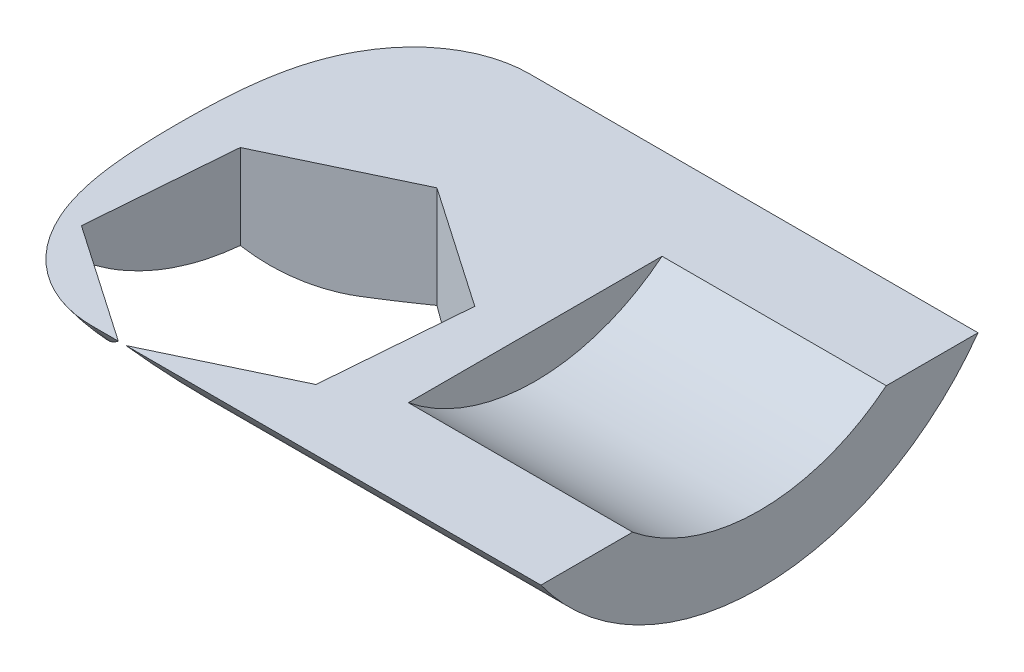
ISO-10303-21;
HEADER;
FILE_DESCRIPTION(('STEP AP214'),'2;1');
FILE_NAME('part.step','',(''),(''),'','','');
FILE_SCHEMA(('AUTOMOTIVE_DESIGN { 1 0 10303 214 1 1 1 1 }'));
ENDSEC;
DATA;
#1=APPLICATION_CONTEXT('core data for automotive mechanical design processes');
#2=APPLICATION_PROTOCOL_DEFINITION('international standard','automotive_design',2000,#1);
#3=PRODUCT_CONTEXT('',#1,'mechanical');
#4=PRODUCT('Part','Part','',(#3));
#5=PRODUCT_RELATED_PRODUCT_CATEGORY('part','',(#4));
#6=PRODUCT_DEFINITION_FORMATION('','',#4);
#7=PRODUCT_DEFINITION_CONTEXT('part definition',#1,'design');
#8=PRODUCT_DEFINITION('design','',#6,#7);
#9=PRODUCT_DEFINITION_SHAPE('','',#8);
#10=(LENGTH_UNIT() NAMED_UNIT(*) SI_UNIT(.MILLI.,.METRE.));
#11=(NAMED_UNIT(*) PLANE_ANGLE_UNIT() SI_UNIT($,.RADIAN.));
#12=(NAMED_UNIT(*) SI_UNIT($,.STERADIAN.) SOLID_ANGLE_UNIT());
#13=UNCERTAINTY_MEASURE_WITH_UNIT(LENGTH_MEASURE(1.E-05),#10,'distance_accuracy_value','');
#14=(GEOMETRIC_REPRESENTATION_CONTEXT(3) GLOBAL_UNCERTAINTY_ASSIGNED_CONTEXT((#13)) GLOBAL_UNIT_ASSIGNED_CONTEXT((#10,
#11,#12)) REPRESENTATION_CONTEXT('',''));
#15=CARTESIAN_POINT('',(0.,0.,0.));
#16=DIRECTION('',(0.,0.,1.));
#17=DIRECTION('',(1.,0.,0.));
#18=AXIS2_PLACEMENT_3D('',#15,#16,#17);
#19=CARTESIAN_POINT('',(31.3,-26.5,-15.));
#20=DIRECTION('',(1.,0.,0.));
#21=DIRECTION('',(0.,0.,-1.));
#22=AXIS2_PLACEMENT_3D('',#19,#20,#21);
#23=CYLINDRICAL_SURFACE('',#22,6.);
#24=DIRECTION('',(1.,0.,0.));
#25=VECTOR('',#24,1.);
#26=CARTESIAN_POINT('',(31.3,-30.,-10.1266028275955));
#27=LINE('',#26,#25);
#28=CARTESIAN_POINT('',(34.8761108116179,-30.,-10.1266028275955));
#29=VERTEX_POINT('',#28);
#30=CARTESIAN_POINT('',(34.3,-30.,-10.1266028275955));
#31=VERTEX_POINT('',#30);
#32=EDGE_CURVE('E173',#29,#31,#27,.F.);
#33=ORIENTED_EDGE('',*,*,#32,.T.);
#34=CARTESIAN_POINT('',(34.3,-26.5,-15.));
#35=DIRECTION('',(-1.,0.,0.));
#36=DIRECTION('',(0.,0.,1.));
#37=AXIS2_PLACEMENT_3D('',#34,#35,#36);
#38=CIRCLE('',#37,6.);
#39=CARTESIAN_POINT('',(34.3,-30.4949345628794,-10.5233385387868));
#40=VERTEX_POINT('',#39);
#41=EDGE_CURVE('E199',#31,#40,#38,.F.);
#42=ORIENTED_EDGE('',*,*,#41,.T.);
#43=CARTESIAN_POINT('',(27.7993170642149,-26.5,-15.));
#44=DIRECTION('',(0.567168892324626,0.,-0.823601510185148));
#45=DIRECTION('',(0.823601510185148,0.,0.567168892324626));
#46=AXIS2_PLACEMENT_3D('',#43,#44,#45);
#47=ELLIPSE('',#46,10.5788594564982,6.);
#48=EDGE_CURVE('E184',#29,#40,#47,.T.);
#49=ORIENTED_EDGE('',*,*,#48,.F.);
#50=EDGE_LOOP('',(#33,#42,#49));
#51=FACE_BOUND('',#50,.T.);
#52=ADVANCED_FACE('F42',(#51),#23,.T.);
#53=CARTESIAN_POINT('',(34.3,-26.5,-15.));
#54=DIRECTION('',(-1.,0.,0.));
#55=DIRECTION('',(0.,0.,1.));
#56=AXIS2_PLACEMENT_3D('',#53,#54,#55);
#57=CIRCLE('',#56,6.);
#58=CARTESIAN_POINT('',(34.3,-32.401387876061,-16.0833379603247));
#59=VERTEX_POINT('',#58);
#60=CARTESIAN_POINT('',(34.3,-30.,-19.8733971724045));
#61=VERTEX_POINT('',#60);
#62=EDGE_CURVE('E195',#59,#61,#57,.F.);
#63=ORIENTED_EDGE('',*,*,#62,.T.);
#64=DIRECTION('',(1.,0.,0.));
#65=VECTOR('',#64,1.);
#66=CARTESIAN_POINT('',(31.3,-30.,-19.8733971724045));
#67=LINE('',#66,#65);
#68=CARTESIAN_POINT('',(44.3,-30.,-19.8733971724045));
#69=VERTEX_POINT('',#68);
#70=EDGE_CURVE('E292',#61,#69,#67,.T.);
#71=ORIENTED_EDGE('',*,*,#70,.T.);
#72=CARTESIAN_POINT('',(44.3,-26.5,-15.));
#73=DIRECTION('',(-1.,0.,0.));
#74=DIRECTION('',(0.,0.,1.));
#75=AXIS2_PLACEMENT_3D('',#72,#73,#74);
#76=CIRCLE('',#75,6.);
#77=CARTESIAN_POINT('',(44.3,-30.,-10.1266028275955));
#78=VERTEX_POINT('',#77);
#79=EDGE_CURVE('E169',#69,#78,#76,.T.);
#80=ORIENTED_EDGE('',*,*,#79,.T.);
#81=CARTESIAN_POINT('',(35.0474640746686,-30.,-10.1266028275955));
#82=VERTEX_POINT('',#81);
#83=EDGE_CURVE('E174',#78,#82,#27,.F.);
#84=ORIENTED_EDGE('',*,*,#83,.T.);
#85=CARTESIAN_POINT('',(45.2891419247907,-26.5,-15.));
#86=DIRECTION('',(-0.429675384253254,0.,-0.902983424081981));
#87=DIRECTION('',(0.902983424081981,0.,-0.429675384253254));
#88=AXIS2_PLACEMENT_3D('',#85,#86,#87);
#89=ELLIPSE('',#88,13.9640301024635,6.);
#90=CARTESIAN_POINT('',(37.9177553890348,-31.367931025036,-11.4924014574795));
#91=VERTEX_POINT('',#90);
#92=EDGE_CURVE('E191',#91,#82,#89,.T.);
#93=ORIENTED_EDGE('',*,*,#92,.F.);
#94=CARTESIAN_POINT('',(38.197076735437,-26.5,-15.));
#95=DIRECTION('',(-0.996844276577879,0.,-0.0793819138968336));
#96=DIRECTION('',(0.0793819138968336,0.,-0.996844276577879));
#97=AXIS2_PLACEMENT_3D('',#94,#95,#96);
#98=ELLIPSE('',#97,6.01899428123089,6.);
#99=CARTESIAN_POINT('',(38.1789930543704,-32.4957010781389,-14.772912832587));
#100=VERTEX_POINT('',#99);
#101=EDGE_CURVE('E188',#100,#91,#98,.T.);
#102=ORIENTED_EDGE('',*,*,#101,.F.);
#103=CARTESIAN_POINT('',(37.8492335478883,-26.5,-15.));
#104=DIRECTION('',(-0.567168892324626,0.,0.823601510185148));
#105=DIRECTION('',(0.823601510185148,0.,0.567168892324626));
#106=AXIS2_PLACEMENT_3D('',#103,#104,#105);
#107=ELLIPSE('',#106,10.5788594564982,6.);
#108=CARTESIAN_POINT('',(35.4686056987913,-32.2716847428764,-16.6394069747467));
#109=VERTEX_POINT('',#108);
#110=EDGE_CURVE('E178',#109,#100,#107,.T.);
#111=ORIENTED_EDGE('',*,*,#110,.F.);
#112=CARTESIAN_POINT('',(32.0233133274504,-26.5,-15.));
#113=DIRECTION('',(0.429675384253253,0.,0.902983424081981));
#114=DIRECTION('',(0.902983424081981,0.,-0.429675384253253));
#115=AXIS2_PLACEMENT_3D('',#112,#113,#114);
#116=ELLIPSE('',#115,13.9640301024635,6.);
#117=EDGE_CURVE('E181',#59,#109,#116,.T.);
#118=ORIENTED_EDGE('',*,*,#117,.F.);
#119=EDGE_LOOP('',(#63,#71,#80,#84,#93,#102,#111,#118));
#120=FACE_BOUND('',#119,.T.);
#121=ADVANCED_FACE('F235',(#120),#23,.T.);
#122=CARTESIAN_POINT('',(44.3,-26.5,-15.));
#123=DIRECTION('',(-1.,0.,0.));
#124=DIRECTION('',(0.,0.,1.));
#125=AXIS2_PLACEMENT_3D('',#122,#123,#124);
#126=PLANE('',#125);
#127=ORIENTED_EDGE('',*,*,#79,.F.);
#128=DIRECTION('',(0.,0.,1.));
#129=VECTOR('',#128,1.);
#130=CARTESIAN_POINT('',(44.3,-30.,-15.));
#131=LINE('',#130,#129);
#132=CARTESIAN_POINT('',(44.3,-30.,-17.8284271247462));
#133=VERTEX_POINT('',#132);
#134=EDGE_CURVE('E308',#69,#133,#131,.T.);
#135=ORIENTED_EDGE('',*,*,#134,.T.);
#136=CARTESIAN_POINT('',(44.3,-26.5,-15.));
#137=DIRECTION('',(1.,0.,0.));
#138=DIRECTION('',(0.,0.,-1.));
#139=AXIS2_PLACEMENT_3D('',#136,#137,#138);
#140=CIRCLE('',#139,4.5);
#141=CARTESIAN_POINT('',(44.3,-30.,-12.1715728752538));
#142=VERTEX_POINT('',#141);
#143=EDGE_CURVE('E137',#142,#133,#140,.T.);
#144=ORIENTED_EDGE('',*,*,#143,.F.);
#145=EDGE_CURVE('E139',#142,#78,#131,.T.);
#146=ORIENTED_EDGE('',*,*,#145,.T.);
#147=EDGE_LOOP('',(#127,#135,#144,#146));
#148=FACE_BOUND('',#147,.T.);
#149=ADVANCED_FACE('F231',(#148),#126,.F.);
#150=CARTESIAN_POINT('',(38.1789930543704,-43.,-14.772912832587));
#151=DIRECTION('',(-0.996844276577879,0.,-0.0793819138968336));
#152=DIRECTION('',(-0.0793819138968336,0.,0.996844276577879));
#153=AXIS2_PLACEMENT_3D('',#150,#151,#152);
#154=PLANE('',#153);
#155=DIRECTION('',(-0.0793819138968336,0.,0.99684427657788));
#156=VECTOR('',#155,1.);
#157=CARTESIAN_POINT('',(38.1789930543704,-30.,-14.772912832587));
#158=LINE('',#157,#156);
#159=CARTESIAN_POINT('',(38.1789930543704,-30.,-14.772912832587));
#160=VERTEX_POINT('',#159);
#161=CARTESIAN_POINT('',(37.9177553890348,-30.,-11.4924014574795));
#162=VERTEX_POINT('',#161);
#163=EDGE_CURVE('E297',#160,#162,#158,.T.);
#164=ORIENTED_EDGE('',*,*,#163,.F.);
#165=DIRECTION('',(0.,1.,0.));
#166=VECTOR('',#165,1.);
#167=CARTESIAN_POINT('',(38.1789930543704,-43.,-14.772912832587));
#168=LINE('',#167,#166);
#169=EDGE_CURVE('E143',#100,#160,#168,.T.);
#170=ORIENTED_EDGE('',*,*,#169,.F.);
#171=ORIENTED_EDGE('',*,*,#101,.T.);
#172=DIRECTION('',(0.,1.,0.));
#173=VECTOR('',#172,1.);
#174=CARTESIAN_POINT('',(37.9177553890348,-43.,-11.4924014574795));
#175=LINE('',#174,#173);
#176=EDGE_CURVE('E165',#91,#162,#175,.T.);
#177=ORIENTED_EDGE('',*,*,#176,.T.);
#178=EDGE_LOOP('',(#164,#170,#171,#177));
#179=FACE_BOUND('',#178,.T.);
#180=ADVANCED_FACE('F227',(#179),#154,.T.);
#181=CARTESIAN_POINT('',(37.9177553890348,-43.,-11.4924014574795));
#182=DIRECTION('',(-0.429675384253254,0.,-0.902983424081981));
#183=DIRECTION('',(-0.902983424081981,0.,0.429675384253254));
#184=AXIS2_PLACEMENT_3D('',#181,#182,#183);
#185=PLANE('',#184);
#186=DIRECTION('',(-0.902983424081981,0.,0.429675384253254));
#187=VECTOR('',#186,1.);
#188=CARTESIAN_POINT('',(37.9177553890348,-30.,-11.4924014574795));
#189=LINE('',#188,#187);
#190=EDGE_CURVE('E150',#162,#82,#189,.T.);
#191=ORIENTED_EDGE('',*,*,#190,.F.);
#192=ORIENTED_EDGE('',*,*,#176,.F.);
#193=ORIENTED_EDGE('',*,*,#92,.T.);
#194=EDGE_LOOP('',(#191,#192,#193));
#195=FACE_BOUND('',#194,.T.);
#196=ADVANCED_FACE('F221',(#195),#185,.T.);
#197=CARTESIAN_POINT('',(34.9461303681201,-43.,-10.0783842245317));
#198=DIRECTION('',(0.567168892324626,0.,-0.823601510185148));
#199=DIRECTION('',(-0.823601510185148,0.,-0.567168892324626));
#200=AXIS2_PLACEMENT_3D('',#197,#198,#199);
#201=PLANE('',#200);
#202=DIRECTION('',(-0.823601510185148,0.,-0.567168892324626));
#203=VECTOR('',#202,1.);
#204=CARTESIAN_POINT('',(34.9461303681201,-30.,-10.0783842245317));
#205=LINE('',#204,#203);
#206=CARTESIAN_POINT('',(32.2357430125409,-30.,-11.9448783666914));
#207=VERTEX_POINT('',#206);
#208=EDGE_CURVE('E286',#29,#207,#205,.T.);
#209=ORIENTED_EDGE('',*,*,#208,.F.);
#210=ORIENTED_EDGE('',*,*,#48,.T.);
#211=CARTESIAN_POINT('',(34.3,-30.4949345628794,-10.5233385387868));
#212=CARTESIAN_POINT('',(34.2469889890921,-30.5358375123047,-10.5598442954735));
#213=CARTESIAN_POINT('',(34.1927859932294,-30.5744281804482,-10.597170906394));
#214=CARTESIAN_POINT('',(34.0821135552941,-30.6466025272526,-10.673384904618));
#215=CARTESIAN_POINT('',(34.0256424061577,-30.6801823414887,-10.7122734674824));
#216=CARTESIAN_POINT('',(33.8522232628604,-30.773227213168,-10.8316976576951));
#217=CARTESIAN_POINT('',(33.7321093170296,-30.8243397624952,-10.914413501179));
#218=CARTESIAN_POINT('',(33.4857331791529,-30.9008607501251,-11.0840791458952));
#219=CARTESIAN_POINT('',(33.3594417518117,-30.926131393864,-11.1710490798612));
#220=CARTESIAN_POINT('',(33.1056753440101,-30.9470238927237,-11.3458039954875));
#221=CARTESIAN_POINT('',(32.9782115735421,-30.9428179332784,-11.4335812574447));
#222=CARTESIAN_POINT('',(32.7989571158868,-30.9143334080989,-11.5570239065114));
#223=CARTESIAN_POINT('',(32.7456382129516,-30.9029311616177,-11.5937416914399));
#224=CARTESIAN_POINT('',(32.6400649320713,-30.8743045752227,-11.6664441817042));
#225=CARTESIAN_POINT('',(32.5878102580452,-30.8570818787513,-11.7024290909348));
#226=CARTESIAN_POINT('',(32.484333134612,-30.8165804940874,-11.7736880732858));
#227=CARTESIAN_POINT('',(32.4331264321711,-30.7932424218798,-11.8089513023399));
#228=CARTESIAN_POINT('',(32.3327591581326,-30.7406661018427,-11.8780687030952));
#229=CARTESIAN_POINT('',(32.2836004360919,-30.7114226544071,-11.9119216011085));
#230=CARTESIAN_POINT('',(32.2357430125409,-30.6792828658652,-11.9448783666914));
#231=B_SPLINE_CURVE_WITH_KNOTS('',3,(#211,#212,#213,#214,#215,#216,#217,#218,#219,#220,#221,
#222,#223,#224,#225,#226,#227,#228,#229,#230),.UNSPECIFIED.,.F.,.F.,(4,2,2,2,2,2,2,2,2,4),(0.,
0.228688758434566,0.457552982605989,0.918883531873738,1.38266136576086,1.84373234267548,
2.04072491224721,2.23766190607086,2.4365871143241,2.63568824337295),.UNSPECIFIED.);
#232=CARTESIAN_POINT('',(32.2357430125409,-30.6792828658652,-11.9448783666914));
#233=VERTEX_POINT('',#232);
#234=EDGE_CURVE('E202',#40,#233,#231,.T.);
#235=ORIENTED_EDGE('',*,*,#234,.T.);
#236=DIRECTION('',(0.,1.,0.));
#237=VECTOR('',#236,1.);
#238=CARTESIAN_POINT('',(32.2357430125409,-43.,-11.9448783666914));
#239=LINE('',#238,#237);
#240=EDGE_CURVE('E161',#233,#207,#239,.T.);
#241=ORIENTED_EDGE('',*,*,#240,.T.);
#242=EDGE_LOOP('',(#209,#210,#235,#241));
#243=FACE_BOUND('',#242,.T.);
#244=ADVANCED_FACE('F216',(#243),#201,.T.);
#245=CARTESIAN_POINT('',(32.2357430125409,-43.,-11.9448783666914));
#246=DIRECTION('',(0.996844276577879,0.,0.0793819138968337));
#247=DIRECTION('',(0.0793819138968337,0.,-0.996844276577879));
#248=AXIS2_PLACEMENT_3D('',#245,#246,#247);
#249=PLANE('',#248);
#250=DIRECTION('',(0.0793819138968337,0.,-0.99684427657788));
#251=VECTOR('',#250,1.);
#252=CARTESIAN_POINT('',(32.2357430125409,-30.,-11.9448783666914));
#253=LINE('',#252,#251);
#254=CARTESIAN_POINT('',(32.4969806778765,-30.,-15.2253897417989));
#255=VERTEX_POINT('',#254);
#256=EDGE_CURVE('E282',#207,#255,#253,.T.);
#257=ORIENTED_EDGE('',*,*,#256,.F.);
#258=ORIENTED_EDGE('',*,*,#240,.F.);
#259=CARTESIAN_POINT('',(32.2357430125409,-30.6792828658652,-11.9448783666914));
#260=CARTESIAN_POINT('',(32.2435051363516,-30.7596501108885,-12.0423518126562));
#261=CARTESIAN_POINT('',(32.2514897149194,-30.8365199877144,-12.1426187507465));
#262=CARTESIAN_POINT('',(32.2678704268688,-30.9829346871232,-12.3483207570527));
#263=CARTESIAN_POINT('',(32.2762665270224,-31.0524800996916,-12.4537554080052));
#264=CARTESIAN_POINT('',(32.3020603491228,-31.2499309651848,-12.7776632438044));
#265=CARTESIAN_POINT('',(32.3200304787784,-31.3663082114904,-13.003324480945));
#266=CARTESIAN_POINT('',(32.349539925575,-31.5250326298703,-13.3738915496898));
#267=CARTESIAN_POINT('',(32.3607230786645,-31.5782404120698,-13.5143248247791));
#268=CARTESIAN_POINT('',(32.3834058415424,-31.6725510769015,-13.7991653034455));
#269=CARTESIAN_POINT('',(32.3949053445532,-31.7136579904302,-13.9435711661553));
#270=CARTESIAN_POINT('',(32.4181135811646,-31.7833889734769,-14.2350103202378));
#271=CARTESIAN_POINT('',(32.4298218279595,-31.8120389182609,-14.3820374985111));
#272=CARTESIAN_POINT('',(32.4533833348975,-31.8567681810875,-14.6779128709446));
#273=CARTESIAN_POINT('',(32.4652364949548,-31.8728557267696,-14.8267598082696));
#274=CARTESIAN_POINT('',(32.4804262627323,-31.8853299957,-15.0175064447285));
#275=CARTESIAN_POINT('',(32.4837366489391,-31.8875560452172,-15.0590768652635));
#276=CARTESIAN_POINT('',(32.490357906162,-31.8910256187301,-15.1422237943606));
#277=CARTESIAN_POINT('',(32.493668774484,-31.8922699585009,-15.1838002690926));
#278=CARTESIAN_POINT('',(32.4969806778765,-31.8930247558007,-15.2253897417989));
#279=B_SPLINE_CURVE_WITH_KNOTS('',3,(#259,#260,#261,#262,#263,#264,#265,#266,#267,#268,#269,
#270,#271,#272,#273,#274,#275,#276,#277,#278),.UNSPECIFIED.,.F.,.F.,(4,2,2,2,2,2,2,2,2,4),(0.,
0.379521656063172,0.759012718243936,1.51960055095346,1.97092903825332,2.42210701385088,
2.87234328520011,3.32228443012563,3.44756127236426,3.57273390285082),.UNSPECIFIED.);
#280=CARTESIAN_POINT('',(32.4969806778765,-31.8930247558002,-15.2253897417989));
#281=VERTEX_POINT('',#280);
#282=EDGE_CURVE('E66',#233,#281,#279,.T.);
#283=ORIENTED_EDGE('',*,*,#282,.T.);
#284=DIRECTION('',(0.,1.,0.));
#285=VECTOR('',#284,1.);
#286=CARTESIAN_POINT('',(32.4969806778765,-43.,-15.2253897417989));
#287=LINE('',#286,#285);
#288=EDGE_CURVE('E158',#281,#255,#287,.T.);
#289=ORIENTED_EDGE('',*,*,#288,.T.);
#290=EDGE_LOOP('',(#257,#258,#283,#289));
#291=FACE_BOUND('',#290,.T.);
#292=ADVANCED_FACE('F220',(#291),#249,.T.);
#293=CARTESIAN_POINT('',(32.4969806778765,-43.,-15.2253897417989));
#294=DIRECTION('',(0.429675384253253,0.,0.902983424081981));
#295=DIRECTION('',(0.902983424081981,0.,-0.429675384253253));
#296=AXIS2_PLACEMENT_3D('',#293,#294,#295);
#297=PLANE('',#296);
#298=DIRECTION('',(0.902983424081981,0.,-0.429675384253253));
#299=VECTOR('',#298,1.);
#300=CARTESIAN_POINT('',(32.4969806778765,-30.,-15.2253897417989));
#301=LINE('',#300,#299);
#302=CARTESIAN_POINT('',(35.4686056987913,-30.,-16.6394069747467));
#303=VERTEX_POINT('',#302);
#304=EDGE_CURVE('E285',#255,#303,#301,.T.);
#305=ORIENTED_EDGE('',*,*,#304,.F.);
#306=ORIENTED_EDGE('',*,*,#288,.F.);
#307=CARTESIAN_POINT('',(32.4969806778765,-31.8930247558002,-15.2253897417989));
#308=CARTESIAN_POINT('',(32.5643435865098,-31.9423947238856,-15.2574436897226));
#309=CARTESIAN_POINT('',(32.633660051906,-31.9884769594771,-15.2904272175592));
#310=CARTESIAN_POINT('',(32.7756230531714,-32.073808515856,-15.3579788530507));
#311=CARTESIAN_POINT('',(32.848268862142,-32.1130593192627,-15.3925466148184));
#312=CARTESIAN_POINT('',(32.994352853087,-32.1835320306512,-15.462059180906));
#313=CARTESIAN_POINT('',(33.0677172280333,-32.2149414191538,-15.49696886491));
#314=CARTESIAN_POINT('',(33.2165189043427,-32.2709045145242,-15.5677746136543));
#315=CARTESIAN_POINT('',(33.2919561615554,-32.295458367284,-15.603670657386));
#316=CARTESIAN_POINT('',(33.5179693888634,-32.3579025561758,-15.7112167293292));
#317=CARTESIAN_POINT('',(33.6709244602291,-32.385855133188,-15.7839988284351));
#318=CARTESIAN_POINT('',(33.9037790691711,-32.4075308223644,-15.8948003015342));
#319=CARTESIAN_POINT('',(33.9830584484591,-32.4112869594923,-15.9325245795779));
#320=CARTESIAN_POINT('',(34.1416278215457,-32.4116672891318,-16.0079781864711));
#321=CARTESIAN_POINT('',(34.2209178145472,-32.4082918640463,-16.0457075149413));
#322=CARTESIAN_POINT('',(34.3,-32.401387876061,-16.0833379603247));
#323=B_SPLINE_CURVE_WITH_KNOTS('',3,(#307,#308,#309,#310,#311,#312,#313,#314,#315,#316,#317,
#318,#319,#320,#321,#322),.UNSPECIFIED.,.F.,.F.,(4,2,2,2,2,2,2,4),(0.,0.268270185096545,
0.536482074973463,0.797483347654204,1.05847906556785,1.57089289780647,1.83428870863059,
2.09767039621236),.UNSPECIFIED.);
#324=EDGE_CURVE('E244',#281,#59,#323,.T.);
#325=ORIENTED_EDGE('',*,*,#324,.T.);
#326=ORIENTED_EDGE('',*,*,#117,.T.);
#327=DIRECTION('',(0.,1.,0.));
#328=VECTOR('',#327,1.);
#329=CARTESIAN_POINT('',(35.4686056987913,-43.,-16.6394069747467));
#330=LINE('',#329,#328);
#331=EDGE_CURVE('E148',#109,#303,#330,.T.);
#332=ORIENTED_EDGE('',*,*,#331,.T.);
#333=EDGE_LOOP('',(#305,#306,#325,#326,#332));
#334=FACE_BOUND('',#333,.T.);
#335=ADVANCED_FACE('F250',(#334),#297,.T.);
#336=CARTESIAN_POINT('',(35.4686056987913,-43.,-16.6394069747467));
#337=DIRECTION('',(-0.567168892324626,0.,0.823601510185148));
#338=DIRECTION('',(0.823601510185148,0.,0.567168892324626));
#339=AXIS2_PLACEMENT_3D('',#336,#337,#338);
#340=PLANE('',#339);
#341=DIRECTION('',(0.823601510185148,0.,0.567168892324626));
#342=VECTOR('',#341,1.);
#343=CARTESIAN_POINT('',(35.4686056987913,-30.,-16.6394069747467));
#344=LINE('',#343,#342);
#345=EDGE_CURVE('E290',#303,#160,#344,.T.);
#346=ORIENTED_EDGE('',*,*,#345,.F.);
#347=ORIENTED_EDGE('',*,*,#331,.F.);
#348=ORIENTED_EDGE('',*,*,#110,.T.);
#349=ORIENTED_EDGE('',*,*,#169,.T.);
#350=EDGE_LOOP('',(#346,#347,#348,#349));
#351=FACE_BOUND('',#350,.T.);
#352=ADVANCED_FACE('F254',(#351),#340,.T.);
#353=CARTESIAN_POINT('',(34.3,-26.5,-15.));
#354=DIRECTION('',(-1.,0.,0.));
#355=DIRECTION('',(0.,0.,1.));
#356=AXIS2_PLACEMENT_3D('',#353,#354,#355);
#357=TOROIDAL_SURFACE('',#356,3.,3.);
#358=CARTESIAN_POINT('',(31.6635442484442,-30.,-17.7180710038325));
#359=CARTESIAN_POINT('',(31.6123433716961,-30.,-17.56432522151));
#360=CARTESIAN_POINT('',(31.5695004594068,-30.,-17.4078292765641));
#361=CARTESIAN_POINT('',(31.4977523790664,-30.,-17.0916173812309));
#362=CARTESIAN_POINT('',(31.4688617091126,-30.,-16.9318982602812));
#363=CARTESIAN_POINT('',(31.4218723530794,-30.,-16.6100110460859));
#364=CARTESIAN_POINT('',(31.4038367836246,-30.,-16.4478341460611));
#365=CARTESIAN_POINT('',(31.3757837411868,-30.,-16.1228772543403));
#366=CARTESIAN_POINT('',(31.3657641704447,-30.,-15.9600974316369));
#367=CARTESIAN_POINT('',(31.3542697764837,-30.,-15.7017357963087));
#368=CARTESIAN_POINT('',(31.35097477504,-30.,-15.6062249211424));
#369=CARTESIAN_POINT('',(31.3459533067539,-30.,-15.4151601571404));
#370=CARTESIAN_POINT('',(31.34422685994,-30.,-15.319606267771));
#371=CARTESIAN_POINT('',(31.3421327107413,-30.,-15.1284639231322));
#372=CARTESIAN_POINT('',(31.3417653034738,-30.,-15.0328754648625));
#373=CARTESIAN_POINT('',(31.3423449317167,-30.,-14.8417034003456));
#374=CARTESIAN_POINT('',(31.343291956541,-30.,-14.7461197940652));
#375=CARTESIAN_POINT('',(31.3466136284885,-30.,-14.5551475931861));
#376=CARTESIAN_POINT('',(31.3489856944572,-30.,-14.459758958132));
#377=CARTESIAN_POINT('',(31.3554299877492,-30.,-14.269039805221));
#378=CARTESIAN_POINT('',(31.3595022676127,-30.,-14.1737092892513));
#379=CARTESIAN_POINT('',(31.3748423838544,-30.,-13.8879359531525));
#380=CARTESIAN_POINT('',(31.389234355574,-30.,-13.6976246294738));
#381=CARTESIAN_POINT('',(31.4241417207995,-30.,-13.378091155224));
#382=CARTESIAN_POINT('',(31.4412996691355,-30.,-13.2485115846191));
#383=CARTESIAN_POINT('',(31.4831701134921,-30.,-12.9905312858166));
#384=CARTESIAN_POINT('',(31.5078834044257,-30.,-12.8621306831255));
#385=CARTESIAN_POINT('',(31.5663782235917,-30.,-12.6077321605245));
#386=CARTESIAN_POINT('',(31.6001345026777,-30.,-12.4817285813252));
#387=CARTESIAN_POINT('',(31.6781509739457,-30.,-12.2330720388804));
#388=CARTESIAN_POINT('',(31.7224065097745,-30.,-12.1104176171178));
#389=CARTESIAN_POINT('',(31.8426852913658,-30.,-11.8220111919688));
#390=CARTESIAN_POINT('',(31.9243441968816,-30.,-11.6584977475071));
#391=CARTESIAN_POINT('',(32.065526041276,-30.,-11.4245153497321));
#392=CARTESIAN_POINT('',(32.1157513642025,-30.,-11.3483443962193));
#393=CARTESIAN_POINT('',(32.2224945529945,-30.,-11.2005656369987));
#394=CARTESIAN_POINT('',(32.2790092871793,-30.,-11.128955587966));
#395=CARTESIAN_POINT('',(32.3988809739812,-30.,-10.9904184186303));
#396=CARTESIAN_POINT('',(32.4623015894131,-30.,-10.9235462469297));
#397=CARTESIAN_POINT('',(32.5952362921128,-30.,-10.7962125540847));
#398=CARTESIAN_POINT('',(32.6647471392877,-30.,-10.735747661553));
#399=CARTESIAN_POINT('',(32.8094778055488,-30.,-10.6220732976967));
#400=CARTESIAN_POINT('',(32.8846974740728,-30.,-10.568863635129));
#401=CARTESIAN_POINT('',(33.0402521515793,-30.,-10.4705473312334));
#402=CARTESIAN_POINT('',(33.120585892088,-30.,-10.4254386910855));
#403=CARTESIAN_POINT('',(33.2733031328372,-30.,-10.3501441606103));
#404=CARTESIAN_POINT('',(33.3450863274419,-30.,-10.3187361080721));
#405=CARTESIAN_POINT('',(33.4912575241437,-30.,-10.2627302340619));
#406=CARTESIAN_POINT('',(33.5656450755332,-30.,-10.2381312407189));
#407=CARTESIAN_POINT('',(33.7162044627522,-30.,-10.1961240451555));
#408=CARTESIAN_POINT('',(33.7923709234221,-30.,-10.1786965577184));
#409=CARTESIAN_POINT('',(33.9459791941969,-30.,-10.1511818770967));
#410=CARTESIAN_POINT('',(34.0234200576132,-30.,-10.1410894663107));
#411=CARTESIAN_POINT('',(34.134214416878,-30.,-10.1320216662137));
#412=CARTESIAN_POINT('',(34.1673396147606,-30.,-10.129990520006));
#413=CARTESIAN_POINT('',(34.2336393567248,-30.,-10.1272803777115));
#414=CARTESIAN_POINT('',(34.2668138967544,-30.,-10.12660127613));
#415=CARTESIAN_POINT('',(34.4309118800652,-30.,-10.1266089477849));
#416=CARTESIAN_POINT('',(34.5620036986903,-30.,-10.1372069075137));
#417=CARTESIAN_POINT('',(34.8209748403246,-30.,-10.1792370707013));
#418=CARTESIAN_POINT('',(34.9488466627342,-30.,-10.2107139514153));
#419=CARTESIAN_POINT('',(35.2043731482392,-30.,-10.2954317749365));
#420=CARTESIAN_POINT('',(35.3316911849956,-30.,-10.3496908984945));
#421=CARTESIAN_POINT('',(35.5759854630817,-30.,-10.4777279356255));
#422=CARTESIAN_POINT('',(35.6929639906805,-30.,-10.5515015196891));
#423=CARTESIAN_POINT('',(35.9204682059896,-30.,-10.7203926912185));
#424=CARTESIAN_POINT('',(36.0302850104038,-30.,-10.8164611139233));
#425=CARTESIAN_POINT('',(36.2344025342536,-30.,-11.0239052867716));
#426=CARTESIAN_POINT('',(36.3286926904574,-30.,-11.1352913641898));
#427=CARTESIAN_POINT('',(36.4750342335455,-30.,-11.3343115022869));
#428=CARTESIAN_POINT('',(36.5312385160663,-30.,-11.4189492549023));
#429=CARTESIAN_POINT('',(36.6359392677437,-30.,-11.5928865735341));
#430=CARTESIAN_POINT('',(36.6844329602057,-30.,-11.6821878036264));
#431=CARTESIAN_POINT('',(36.8186577655214,-30.,-11.9554810343054));
#432=CARTESIAN_POINT('',(36.8932351745005,-30.,-12.1450065574364));
#433=CARTESIAN_POINT('',(37.0179556823985,-30.,-12.5364706742348));
#434=CARTESIAN_POINT('',(37.0674775363099,-30.,-12.7385970352497));
#435=CARTESIAN_POINT('',(37.1456551515978,-30.,-13.1470320899099));
#436=CARTESIAN_POINT('',(37.1742722772656,-30.,-13.353347806886));
#437=CARTESIAN_POINT('',(37.2063790079689,-30.,-13.6648957745002));
#438=CARTESIAN_POINT('',(37.2152958523229,-30.,-13.7696450083073));
#439=CARTESIAN_POINT('',(37.230157065618,-30.,-13.9793561349332));
#440=CARTESIAN_POINT('',(37.2361015118183,-30.,-14.0843180221535));
#441=CARTESIAN_POINT('',(37.2456489529433,-30.,-14.2942649569644));
#442=CARTESIAN_POINT('',(37.249253639325,-30.,-14.3992499328163));
#443=CARTESIAN_POINT('',(37.2545909867161,-30.,-14.6092659431973));
#444=CARTESIAN_POINT('',(37.2563236481708,-30.,-14.7142969777154));
#445=CARTESIAN_POINT('',(37.2582736042759,-30.,-14.9357645046881));
#446=CARTESIAN_POINT('',(37.2583061752853,-30.,-15.0522025852358));
#447=CARTESIAN_POINT('',(37.2563953125421,-30.,-15.285063699483));
#448=CARTESIAN_POINT('',(37.2544518584642,-30.,-15.4014867330153));
#449=CARTESIAN_POINT('',(37.2482363169167,-30.,-15.6343894756571));
#450=CARTESIAN_POINT('',(37.2439619909202,-30.,-15.7508691315326));
#451=CARTESIAN_POINT('',(37.2324126548417,-30.,-15.9836744646101));
#452=CARTESIAN_POINT('',(37.2251376384644,-30.,-16.1000001414887));
#453=CARTESIAN_POINT('',(37.1976713286795,-30.,-16.4461351126753));
#454=CARTESIAN_POINT('',(37.1718074061937,-30.,-16.6755766365197));
#455=CARTESIAN_POINT('',(37.0963565894967,-30.,-17.1302798668485));
#456=CARTESIAN_POINT('',(37.0468265748736,-30.,-17.355550256892));
#457=CARTESIAN_POINT('',(36.9226991175841,-30.,-17.7725744723753));
#458=CARTESIAN_POINT('',(36.8514772339159,-30.,-17.9652808934241));
#459=CARTESIAN_POINT('',(36.7222223248754,-30.,-18.2439143668709));
#460=CARTESIAN_POINT('',(36.6753842190171,-30.,-18.3350783631366));
#461=CARTESIAN_POINT('',(36.5739221282545,-30.,-18.512940709385));
#462=CARTESIAN_POINT('',(36.5193004912821,-30.,-18.599640395346));
#463=CARTESIAN_POINT('',(36.3680057394286,-30.,-18.8162814109322));
#464=CARTESIAN_POINT('',(36.2653201937997,-30.,-18.9421298357156));
#465=CARTESIAN_POINT('',(36.0405494453332,-30.,-19.1752243843669));
#466=CARTESIAN_POINT('',(35.9184663032161,-30.,-19.2824724817284));
#467=CARTESIAN_POINT('',(35.6562522741532,-30.,-19.4741851891281));
#468=CARTESIAN_POINT('',(35.5160150215693,-30.,-19.5585056396275));
#469=CARTESIAN_POINT('',(35.222077348883,-30.,-19.699030707761));
#470=CARTESIAN_POINT('',(35.0683849349822,-30.,-19.7552519134029));
#471=CARTESIAN_POINT('',(34.7700083994759,-30.,-19.8320665843957));
#472=CARTESIAN_POINT('',(34.6261398665823,-30.,-19.8558480133577));
#473=CARTESIAN_POINT('',(34.3364824280404,-30.,-19.8774397100513));
#474=CARTESIAN_POINT('',(34.1906942375351,-30.,-19.8752593905199));
#475=CARTESIAN_POINT('',(33.909486116005,-30.,-19.8458536728033));
#476=CARTESIAN_POINT('',(33.773924761867,-30.,-19.8199546508398));
#477=CARTESIAN_POINT('',(33.5089867327139,-30.,-19.746086271508));
#478=CARTESIAN_POINT('',(33.3796097656095,-30.,-19.6981179576145));
#479=CARTESIAN_POINT('',(33.1283637238801,-30.,-19.5811646131844));
#480=CARTESIAN_POINT('',(33.0066396676219,-30.,-19.5118694915032));
#481=CARTESIAN_POINT('',(32.7754899129713,-30.,-19.3552150940171));
#482=CARTESIAN_POINT('',(32.6660663502367,-30.,-19.2678526887568));
#483=CARTESIAN_POINT('',(32.4532622104272,-30.,-19.070720813976));
#484=CARTESIAN_POINT('',(32.3510101055572,-30.,-18.9597383958134));
#485=CARTESIAN_POINT('',(32.1636747499134,-30.,-18.7241569478951));
#486=CARTESIAN_POINT('',(32.0786005677583,-30.,-18.5995507790761));
#487=CARTESIAN_POINT('',(31.9319372271089,-30.,-18.3513479974232));
#488=CARTESIAN_POINT('',(31.8689722958741,-30.,-18.2285530267231));
#489=CARTESIAN_POINT('',(31.7565217113787,-30.,-17.9771852406415));
#490=CARTESIAN_POINT('',(31.7070199165885,-30.,-17.8486195615012));
#491=CARTESIAN_POINT('',(31.6635442484442,-30.,-17.7180710038325));
#492=B_SPLINE_CURVE_WITH_KNOTS('',3,(#358,#359,#360,#361,#362,#363,#364,#365,#366,#367,#368,
#369,#370,#371,#372,#373,#374,#375,#376,#377,#378,#379,#380,#381,#382,#383,#384,#385,#386,#387,
#388,#389,#390,#391,#392,#393,#394,#395,#396,#397,#398,#399,#400,#401,#402,#403,#404,#405,#406,
#407,#408,#409,#410,#411,#412,#413,#414,#415,#416,#417,#418,#419,#420,#421,#422,#423,#424,#425,
#426,#427,#428,#429,#430,#431,#432,#433,#434,#435,#436,#437,#438,#439,#440,#441,#442,#443,#444,
#445,#446,#447,#448,#449,#450,#451,#452,#453,#454,#455,#456,#457,#458,#459,#460,#461,#462,#463,
#464,#465,#466,#467,#468,#469,#470,#471,#472,#473,#474,#475,#476,#477,#478,#479,#480,#481,#482,
#483,#484,#485,#486,#487,#488,#489,#490,#491),.UNSPECIFIED.,.T.,.F.,(4,2,2,2,2,2,2,2,2,2,2,2,2,
2,2,2,2,2,2,2,2,2,2,2,2,2,2,2,2,2,2,2,2,2,2,2,2,2,2,2,2,2,2,2,2,2,2,2,2,2,2,2,2,2,2,2,2,2,2,2,2,
2,2,2,2,2,4),(0.,0.485949197737863,0.972402275755445,1.46165716059228,1.95078396719918,
2.237476686002,2.52417306543946,2.81093169772974,3.09768799872808,3.38392646196565,
3.67017377124023,4.24240837005217,4.6343693346002,5.02637155235947,5.41729045755666,
5.80803631574567,6.35402952853439,6.62747728046257,6.90078947891596,7.17687755216385,
7.45281962417431,7.72875442112355,8.0046210409906,8.2393593549457,8.47405724418664,
8.70811980615257,8.94201571088489,9.04155345498829,9.14108343225345,9.53370730707842,
9.92717405067099,10.340497517707,10.7537293609422,11.1896914590927,11.625948940422,
11.9303508708614,12.2348621737605,12.843361317967,13.4662876021355,14.0903622736278,
14.4057207944223,14.7210711179402,15.036193214052,15.3513152352102,15.7006128364574,
16.0499140306118,16.3995512796025,16.7491892621166,17.4410522457426,18.1312606918907,
18.745185114955,19.0523179400829,19.359358312782,19.8445211038169,20.3296323875779,
20.817726797803,21.3055327267741,21.7407400845047,22.1757896574992,22.5879044549551,
22.999999768905,23.4183951723248,23.8368631072926,24.2878153130291,24.7390049678738,
25.15213147848,25.5647604684048),.UNSPECIFIED.);
#493=EDGE_CURVE('E52',#61,#31,#492,.T.);
#494=ORIENTED_EDGE('',*,*,#493,.F.);
#495=ORIENTED_EDGE('',*,*,#62,.F.);
#496=ORIENTED_EDGE('',*,*,#324,.F.);
#497=ORIENTED_EDGE('',*,*,#282,.F.);
#498=ORIENTED_EDGE('',*,*,#234,.F.);
#499=ORIENTED_EDGE('',*,*,#41,.F.);
#500=EDGE_LOOP('',(#494,#495,#496,#497,#498,#499));
#501=FACE_BOUND('',#500,.T.);
#502=ADVANCED_FACE('F44',(#501),#357,.T.);
#503=CARTESIAN_POINT('',(39.3,-26.5,-15.));
#504=DIRECTION('',(1.,0.,0.));
#505=DIRECTION('',(0.,0.,-1.));
#506=AXIS2_PLACEMENT_3D('',#503,#504,#505);
#507=CYLINDRICAL_SURFACE('',#506,4.5);
#508=ORIENTED_EDGE('',*,*,#143,.T.);
#509=DIRECTION('',(1.,0.,0.));
#510=VECTOR('',#509,1.);
#511=CARTESIAN_POINT('',(39.3,-30.,-17.8284271247462));
#512=LINE('',#511,#510);
#513=CARTESIAN_POINT('',(39.3,-30.,-17.8284271247462));
#514=VERTEX_POINT('',#513);
#515=EDGE_CURVE('E127',#133,#514,#512,.F.);
#516=ORIENTED_EDGE('',*,*,#515,.T.);
#517=CARTESIAN_POINT('',(39.3,-26.5,-15.));
#518=DIRECTION('',(1.,0.,0.));
#519=DIRECTION('',(0.,0.,-1.));
#520=AXIS2_PLACEMENT_3D('',#517,#518,#519);
#521=CIRCLE('',#520,4.5);
#522=CARTESIAN_POINT('',(39.3,-30.,-12.1715728752538));
#523=VERTEX_POINT('',#522);
#524=EDGE_CURVE('E135',#523,#514,#521,.T.);
#525=ORIENTED_EDGE('',*,*,#524,.F.);
#526=DIRECTION('',(1.,0.,0.));
#527=VECTOR('',#526,1.);
#528=CARTESIAN_POINT('',(39.3,-30.,-12.1715728752538));
#529=LINE('',#528,#527);
#530=EDGE_CURVE('E58',#523,#142,#529,.T.);
#531=ORIENTED_EDGE('',*,*,#530,.T.);
#532=EDGE_LOOP('',(#508,#516,#525,#531));
#533=FACE_BOUND('',#532,.T.);
#534=ADVANCED_FACE('F134',(#533),#507,.F.);
#535=CARTESIAN_POINT('',(39.3,-26.5,-15.));
#536=DIRECTION('',(1.,0.,0.));
#537=DIRECTION('',(0.,0.,-1.));
#538=AXIS2_PLACEMENT_3D('',#535,#536,#537);
#539=PLANE('',#538);
#540=DIRECTION('',(0.,0.,-1.));
#541=VECTOR('',#540,1.);
#542=CARTESIAN_POINT('',(39.3,-30.,-15.));
#543=LINE('',#542,#541);
#544=EDGE_CURVE('E11',#523,#514,#543,.T.);
#545=ORIENTED_EDGE('',*,*,#544,.F.);
#546=ORIENTED_EDGE('',*,*,#524,.T.);
#547=EDGE_LOOP('',(#545,#546));
#548=FACE_BOUND('',#547,.T.);
#549=ADVANCED_FACE('F141',(#548),#539,.T.);
#550=CARTESIAN_POINT('',(-22.5,-30.,0.));
#551=DIRECTION('',(0.,-1.,0.));
#552=DIRECTION('',(0.,0.,-1.));
#553=AXIS2_PLACEMENT_3D('',#550,#551,#552);
#554=PLANE('',#553);
#555=ORIENTED_EDGE('',*,*,#83,.F.);
#556=ORIENTED_EDGE('',*,*,#145,.F.);
#557=ORIENTED_EDGE('',*,*,#530,.F.);
#558=ORIENTED_EDGE('',*,*,#544,.T.);
#559=ORIENTED_EDGE('',*,*,#515,.F.);
#560=ORIENTED_EDGE('',*,*,#134,.F.);
#561=ORIENTED_EDGE('',*,*,#70,.F.);
#562=ORIENTED_EDGE('',*,*,#493,.T.);
#563=ORIENTED_EDGE('',*,*,#32,.F.);
#564=ORIENTED_EDGE('',*,*,#208,.T.);
#565=ORIENTED_EDGE('',*,*,#256,.T.);
#566=ORIENTED_EDGE('',*,*,#304,.T.);
#567=ORIENTED_EDGE('',*,*,#345,.T.);
#568=ORIENTED_EDGE('',*,*,#163,.T.);
#569=ORIENTED_EDGE('',*,*,#190,.T.);
#570=EDGE_LOOP('',(#555,#556,#557,#558,#559,#560,#561,#562,#563,#564,#565,#566,#567,#568,#569));
#571=FACE_BOUND('',#570,.T.);
#572=ADVANCED_FACE('F126',(#571),#554,.F.);
#573=CLOSED_SHELL('',(#52,#121,#149,#180,#196,#244,#292,#335,#352,#502,#534,#549,#572));
#574=MANIFOLD_SOLID_BREP('B2',#573);
#575=ADVANCED_BREP_SHAPE_REPRESENTATION('',(#18,#574),#14);
#576=SHAPE_DEFINITION_REPRESENTATION(#9,#575);
ENDSEC;
END-ISO-10303-21;
